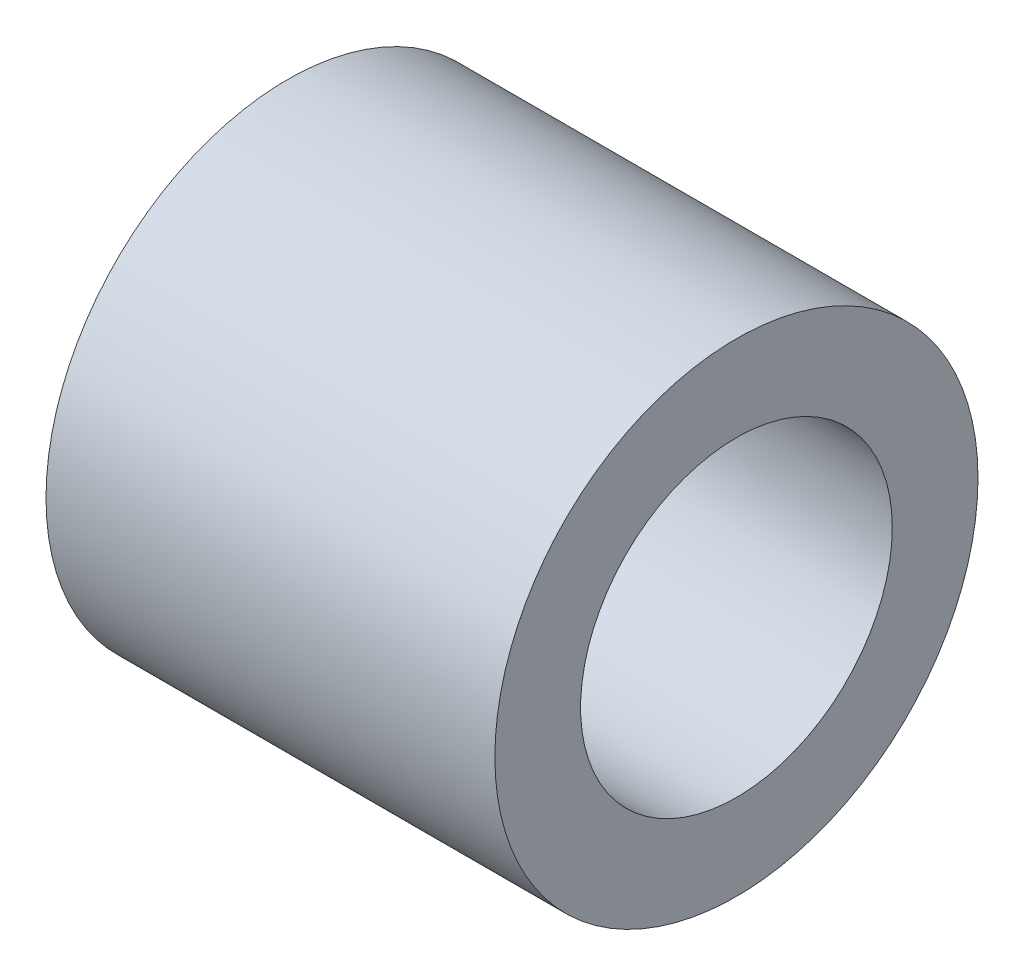
ISO-10303-21;
HEADER;
FILE_DESCRIPTION(('STEP AP214'),'2;1');
FILE_NAME('part.step','',(''),(''),'','','');
FILE_SCHEMA(('AUTOMOTIVE_DESIGN { 1 0 10303 214 1 1 1 1 }'));
ENDSEC;
DATA;
#1=APPLICATION_CONTEXT('core data for automotive mechanical design processes');
#2=APPLICATION_PROTOCOL_DEFINITION('international standard','automotive_design',2000,#1);
#3=PRODUCT_CONTEXT('',#1,'mechanical');
#4=PRODUCT('Part','Part','',(#3));
#5=PRODUCT_RELATED_PRODUCT_CATEGORY('part','',(#4));
#6=PRODUCT_DEFINITION_FORMATION('','',#4);
#7=PRODUCT_DEFINITION_CONTEXT('part definition',#1,'design');
#8=PRODUCT_DEFINITION('design','',#6,#7);
#9=PRODUCT_DEFINITION_SHAPE('','',#8);
#10=(LENGTH_UNIT() NAMED_UNIT(*) SI_UNIT(.MILLI.,.METRE.));
#11=(NAMED_UNIT(*) PLANE_ANGLE_UNIT() SI_UNIT($,.RADIAN.));
#12=(NAMED_UNIT(*) SI_UNIT($,.STERADIAN.) SOLID_ANGLE_UNIT());
#13=UNCERTAINTY_MEASURE_WITH_UNIT(LENGTH_MEASURE(1.E-05),#10,'distance_accuracy_value','');
#14=(GEOMETRIC_REPRESENTATION_CONTEXT(3) GLOBAL_UNCERTAINTY_ASSIGNED_CONTEXT((#13)) GLOBAL_UNIT_ASSIGNED_CONTEXT((#10,
#11,#12)) REPRESENTATION_CONTEXT('',''));
#15=CARTESIAN_POINT('',(0.,0.,0.));
#16=DIRECTION('',(0.,0.,1.));
#17=DIRECTION('',(1.,0.,0.));
#18=AXIS2_PLACEMENT_3D('',#15,#16,#17);
#19=CARTESIAN_POINT('',(7.2,0.,0.));
#20=DIRECTION('',(1.,0.,0.));
#21=DIRECTION('',(0.,0.,-1.));
#22=AXIS2_PLACEMENT_3D('',#19,#20,#21);
#23=PLANE('',#22);
#24=CARTESIAN_POINT('',(7.2,0.,0.));
#25=DIRECTION('',(1.,0.,0.));
#26=DIRECTION('',(0.,0.,-1.));
#27=AXIS2_PLACEMENT_3D('',#24,#25,#26);
#28=CIRCLE('',#27,7.75);
#29=CARTESIAN_POINT('',(7.2,0.,-7.75));
#30=VERTEX_POINT('',#29);
#31=EDGE_CURVE('E10',#30,#30,#28,.T.);
#32=ORIENTED_EDGE('',*,*,#31,.T.);
#33=EDGE_LOOP('',(#32));
#34=FACE_BOUND('',#33,.T.);
#35=CARTESIAN_POINT('',(7.2,0.,0.));
#36=DIRECTION('',(1.,0.,0.));
#37=DIRECTION('',(0.,0.,-1.));
#38=AXIS2_PLACEMENT_3D('',#35,#36,#37);
#39=CIRCLE('',#38,5.);
#40=CARTESIAN_POINT('',(7.2,0.,-5.));
#41=VERTEX_POINT('',#40);
#42=EDGE_CURVE('E48',#41,#41,#39,.T.);
#43=ORIENTED_EDGE('',*,*,#42,.F.);
#44=EDGE_LOOP('',(#43));
#45=FACE_BOUND('',#44,.T.);
#46=ADVANCED_FACE('F37',(#34,#45),#23,.T.);
#47=CARTESIAN_POINT('',(-7.2,0.,0.));
#48=DIRECTION('',(1.,0.,0.));
#49=DIRECTION('',(0.,0.,-1.));
#50=AXIS2_PLACEMENT_3D('',#47,#48,#49);
#51=PLANE('',#50);
#52=CARTESIAN_POINT('',(-7.2,0.,0.));
#53=DIRECTION('',(1.,0.,0.));
#54=DIRECTION('',(0.,0.,-1.));
#55=AXIS2_PLACEMENT_3D('',#52,#53,#54);
#56=CIRCLE('',#55,7.75);
#57=CARTESIAN_POINT('',(-7.2,0.,-7.75));
#58=VERTEX_POINT('',#57);
#59=EDGE_CURVE('E41',#58,#58,#56,.T.);
#60=ORIENTED_EDGE('',*,*,#59,.F.);
#61=EDGE_LOOP('',(#60));
#62=FACE_BOUND('',#61,.T.);
#63=CARTESIAN_POINT('',(-7.2,0.,0.));
#64=DIRECTION('',(1.,0.,0.));
#65=DIRECTION('',(0.,0.,-1.));
#66=AXIS2_PLACEMENT_3D('',#63,#64,#65);
#67=CIRCLE('',#66,5.);
#68=CARTESIAN_POINT('',(-7.2,0.,-5.));
#69=VERTEX_POINT('',#68);
#70=EDGE_CURVE('E50',#69,#69,#67,.T.);
#71=ORIENTED_EDGE('',*,*,#70,.T.);
#72=EDGE_LOOP('',(#71));
#73=FACE_BOUND('',#72,.T.);
#74=ADVANCED_FACE('F60',(#62,#73),#51,.F.);
#75=CARTESIAN_POINT('',(7.2,0.,0.));
#76=DIRECTION('',(-1.,0.,0.));
#77=DIRECTION('',(0.,0.,1.));
#78=AXIS2_PLACEMENT_3D('',#75,#76,#77);
#79=CYLINDRICAL_SURFACE('',#78,7.75);
#80=ORIENTED_EDGE('',*,*,#31,.F.);
#81=EDGE_LOOP('',(#80));
#82=FACE_BOUND('',#81,.T.);
#83=ORIENTED_EDGE('',*,*,#59,.T.);
#84=EDGE_LOOP('',(#83));
#85=FACE_BOUND('',#84,.T.);
#86=ADVANCED_FACE('F39',(#82,#85),#79,.T.);
#87=CARTESIAN_POINT('',(7.2,0.,0.));
#88=DIRECTION('',(-1.,0.,0.));
#89=DIRECTION('',(0.,0.,1.));
#90=AXIS2_PLACEMENT_3D('',#87,#88,#89);
#91=CYLINDRICAL_SURFACE('',#90,5.);
#92=ORIENTED_EDGE('',*,*,#42,.T.);
#93=EDGE_LOOP('',(#92));
#94=FACE_BOUND('',#93,.T.);
#95=ORIENTED_EDGE('',*,*,#70,.F.);
#96=EDGE_LOOP('',(#95));
#97=FACE_BOUND('',#96,.T.);
#98=ADVANCED_FACE('F56',(#94,#97),#91,.F.);
#99=CLOSED_SHELL('',(#46,#74,#86,#98));
#100=MANIFOLD_SOLID_BREP('B2',#99);
#101=ADVANCED_BREP_SHAPE_REPRESENTATION('',(#18,#100),#14);
#102=SHAPE_DEFINITION_REPRESENTATION(#9,#101);
ENDSEC;
END-ISO-10303-21;
